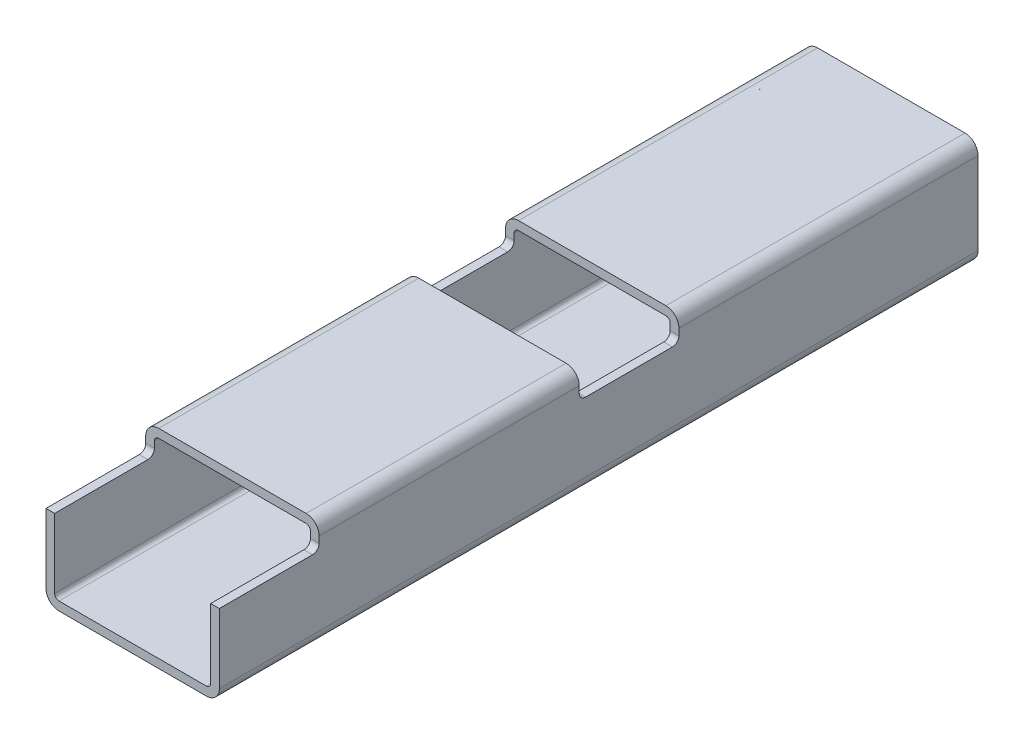
ISO-10303-21;
HEADER;
FILE_DESCRIPTION(('STEP AP214'),'2;1');
FILE_NAME('part.step','',(''),(''),'','','');
FILE_SCHEMA(('AUTOMOTIVE_DESIGN { 1 0 10303 214 1 1 1 1 }'));
ENDSEC;
DATA;
#1=APPLICATION_CONTEXT('core data for automotive mechanical design processes');
#2=APPLICATION_PROTOCOL_DEFINITION('international standard','automotive_design',2000,#1);
#3=PRODUCT_CONTEXT('',#1,'mechanical');
#4=PRODUCT('Part','Part','',(#3));
#5=PRODUCT_RELATED_PRODUCT_CATEGORY('part','',(#4));
#6=PRODUCT_DEFINITION_FORMATION('','',#4);
#7=PRODUCT_DEFINITION_CONTEXT('part definition',#1,'design');
#8=PRODUCT_DEFINITION('design','',#6,#7);
#9=PRODUCT_DEFINITION_SHAPE('','',#8);
#10=(LENGTH_UNIT() NAMED_UNIT(*) SI_UNIT(.MILLI.,.METRE.));
#11=(NAMED_UNIT(*) PLANE_ANGLE_UNIT() SI_UNIT($,.RADIAN.));
#12=(NAMED_UNIT(*) SI_UNIT($,.STERADIAN.) SOLID_ANGLE_UNIT());
#13=UNCERTAINTY_MEASURE_WITH_UNIT(LENGTH_MEASURE(1.E-05),#10,'distance_accuracy_value','');
#14=(GEOMETRIC_REPRESENTATION_CONTEXT(3) GLOBAL_UNCERTAINTY_ASSIGNED_CONTEXT((#13)) GLOBAL_UNIT_ASSIGNED_CONTEXT((#10,
#11,#12)) REPRESENTATION_CONTEXT('',''));
#15=CARTESIAN_POINT('',(0.,0.,0.));
#16=DIRECTION('',(0.,0.,1.));
#17=DIRECTION('',(1.,0.,0.));
#18=AXIS2_PLACEMENT_3D('',#15,#16,#17);
#19=CARTESIAN_POINT('',(34.,19.,350.));
#20=DIRECTION('',(0.,0.,-1.));
#21=DIRECTION('',(-1.,0.,0.));
#22=AXIS2_PLACEMENT_3D('',#19,#20,#21);
#23=CYLINDRICAL_SURFACE('',#22,6.);
#24=DIRECTION('',(0.,0.,-1.));
#25=VECTOR('',#24,1.);
#26=CARTESIAN_POINT('',(34.,25.,350.));
#27=LINE('',#26,#25);
#28=CARTESIAN_POINT('',(34.,25.,138.));
#29=VERTEX_POINT('',#28);
#30=CARTESIAN_POINT('',(34.,25.,0.));
#31=VERTEX_POINT('',#30);
#32=EDGE_CURVE('E343',#29,#31,#27,.T.);
#33=ORIENTED_EDGE('',*,*,#32,.F.);
#34=CARTESIAN_POINT('',(34.,19.,138.));
#35=DIRECTION('',(0.,0.,-1.));
#36=DIRECTION('',(-1.,0.,0.));
#37=AXIS2_PLACEMENT_3D('',#34,#35,#36);
#38=CIRCLE('',#37,6.);
#39=CARTESIAN_POINT('',(40.,19.,138.));
#40=VERTEX_POINT('',#39);
#41=EDGE_CURVE('E524',#29,#40,#38,.T.);
#42=ORIENTED_EDGE('',*,*,#41,.T.);
#43=DIRECTION('',(0.,0.,-1.));
#44=VECTOR('',#43,1.);
#45=CARTESIAN_POINT('',(40.,19.,350.));
#46=LINE('',#45,#44);
#47=CARTESIAN_POINT('',(40.,19.,0.));
#48=VERTEX_POINT('',#47);
#49=EDGE_CURVE('E346',#40,#48,#46,.T.);
#50=ORIENTED_EDGE('',*,*,#49,.T.);
#51=CARTESIAN_POINT('',(34.,19.,0.));
#52=DIRECTION('',(0.,0.,1.));
#53=DIRECTION('',(-1.,0.,0.));
#54=AXIS2_PLACEMENT_3D('',#51,#52,#53);
#55=CIRCLE('',#54,6.);
#56=EDGE_CURVE('E326',#48,#31,#55,.T.);
#57=ORIENTED_EDGE('',*,*,#56,.T.);
#58=EDGE_LOOP('',(#33,#42,#50,#57));
#59=FACE_BOUND('',#58,.T.);
#60=ADVANCED_FACE('F37',(#59),#23,.T.);
#61=CARTESIAN_POINT('',(-34.,25.,350.));
#62=DIRECTION('',(0.,-1.,0.));
#63=DIRECTION('',(0.,0.,-1.));
#64=AXIS2_PLACEMENT_3D('',#61,#62,#63);
#65=PLANE('',#64);
#66=DIRECTION('',(0.,0.,-1.));
#67=VECTOR('',#66,1.);
#68=CARTESIAN_POINT('',(-34.,25.,350.));
#69=LINE('',#68,#67);
#70=CARTESIAN_POINT('',(-34.,25.,138.));
#71=VERTEX_POINT('',#70);
#72=CARTESIAN_POINT('',(-34.,25.,0.));
#73=VERTEX_POINT('',#72);
#74=EDGE_CURVE('E340',#71,#73,#69,.T.);
#75=ORIENTED_EDGE('',*,*,#74,.F.);
#76=DIRECTION('',(1.,0.,0.));
#77=VECTOR('',#76,1.);
#78=CARTESIAN_POINT('',(-40.,25.,138.));
#79=LINE('',#78,#77);
#80=EDGE_CURVE('E465',#71,#29,#79,.T.);
#81=ORIENTED_EDGE('',*,*,#80,.T.);
#82=ORIENTED_EDGE('',*,*,#32,.T.);
#83=DIRECTION('',(-1.,0.,0.));
#84=VECTOR('',#83,1.);
#85=CARTESIAN_POINT('',(-34.,25.,0.));
#86=LINE('',#85,#84);
#87=EDGE_CURVE('E329',#31,#73,#86,.T.);
#88=ORIENTED_EDGE('',*,*,#87,.T.);
#89=EDGE_LOOP('',(#75,#81,#82,#88));
#90=FACE_BOUND('',#89,.T.);
#91=ADVANCED_FACE('F688',(#90),#65,.F.);
#92=CARTESIAN_POINT('',(-34.,19.,350.));
#93=DIRECTION('',(0.,0.,-1.));
#94=DIRECTION('',(-1.,0.,0.));
#95=AXIS2_PLACEMENT_3D('',#92,#93,#94);
#96=CYLINDRICAL_SURFACE('',#95,6.);
#97=DIRECTION('',(0.,0.,-1.));
#98=VECTOR('',#97,1.);
#99=CARTESIAN_POINT('',(-40.,19.,350.));
#100=LINE('',#99,#98);
#101=CARTESIAN_POINT('',(-40.,19.,138.));
#102=VERTEX_POINT('',#101);
#103=CARTESIAN_POINT('',(-40.,19.,0.));
#104=VERTEX_POINT('',#103);
#105=EDGE_CURVE('E309',#102,#104,#100,.T.);
#106=ORIENTED_EDGE('',*,*,#105,.F.);
#107=CARTESIAN_POINT('',(-34.,19.,138.));
#108=DIRECTION('',(0.,0.,-1.));
#109=DIRECTION('',(-1.,0.,0.));
#110=AXIS2_PLACEMENT_3D('',#107,#108,#109);
#111=CIRCLE('',#110,6.);
#112=EDGE_CURVE('E521',#102,#71,#111,.T.);
#113=ORIENTED_EDGE('',*,*,#112,.T.);
#114=ORIENTED_EDGE('',*,*,#74,.T.);
#115=CARTESIAN_POINT('',(-34.,19.,0.));
#116=DIRECTION('',(0.,0.,1.));
#117=DIRECTION('',(-1.,0.,0.));
#118=AXIS2_PLACEMENT_3D('',#115,#116,#117);
#119=CIRCLE('',#118,6.);
#120=EDGE_CURVE('E332',#73,#104,#119,.T.);
#121=ORIENTED_EDGE('',*,*,#120,.T.);
#122=EDGE_LOOP('',(#106,#113,#114,#121));
#123=FACE_BOUND('',#122,.T.);
#124=ADVANCED_FACE('F694',(#123),#96,.T.);
#125=CARTESIAN_POINT('',(34.,19.,350.));
#126=DIRECTION('',(0.,0.,-1.));
#127=DIRECTION('',(-1.,0.,0.));
#128=AXIS2_PLACEMENT_3D('',#125,#126,#127);
#129=CYLINDRICAL_SURFACE('',#128,1.99999999999999);
#130=CARTESIAN_POINT('',(34.,19.,138.));
#131=DIRECTION('',(0.,0.,-1.));
#132=DIRECTION('',(-1.,0.,0.));
#133=AXIS2_PLACEMENT_3D('',#130,#131,#132);
#134=CIRCLE('',#133,1.99999999999999);
#135=CARTESIAN_POINT('',(34.,21.,138.));
#136=VERTEX_POINT('',#135);
#137=CARTESIAN_POINT('',(36.,19.,138.));
#138=VERTEX_POINT('',#137);
#139=EDGE_CURVE('E517',#136,#138,#134,.T.);
#140=ORIENTED_EDGE('',*,*,#139,.F.);
#141=DIRECTION('',(0.,0.,-1.));
#142=VECTOR('',#141,1.);
#143=CARTESIAN_POINT('',(34.,21.,350.));
#144=LINE('',#143,#142);
#145=CARTESIAN_POINT('',(34.,21.,0.));
#146=VERTEX_POINT('',#145);
#147=EDGE_CURVE('E402',#136,#146,#144,.T.);
#148=ORIENTED_EDGE('',*,*,#147,.T.);
#149=CARTESIAN_POINT('',(34.,19.,0.));
#150=DIRECTION('',(0.,0.,1.));
#151=DIRECTION('',(-1.,0.,0.));
#152=AXIS2_PLACEMENT_3D('',#149,#150,#151);
#153=CIRCLE('',#152,1.99999999999999);
#154=CARTESIAN_POINT('',(36.,19.,0.));
#155=VERTEX_POINT('',#154);
#156=EDGE_CURVE('E568',#155,#146,#153,.T.);
#157=ORIENTED_EDGE('',*,*,#156,.F.);
#158=DIRECTION('',(0.,0.,-1.));
#159=VECTOR('',#158,1.);
#160=CARTESIAN_POINT('',(36.,19.,350.));
#161=LINE('',#160,#159);
#162=EDGE_CURVE('E405',#138,#155,#161,.T.);
#163=ORIENTED_EDGE('',*,*,#162,.F.);
#164=EDGE_LOOP('',(#140,#148,#157,#163));
#165=FACE_BOUND('',#164,.T.);
#166=ADVANCED_FACE('F608',(#165),#129,.F.);
#167=CARTESIAN_POINT('',(-34.,21.,350.));
#168=DIRECTION('',(0.,-1.,0.));
#169=DIRECTION('',(0.,0.,-1.));
#170=AXIS2_PLACEMENT_3D('',#167,#168,#169);
#171=PLANE('',#170);
#172=DIRECTION('',(1.,0.,0.));
#173=VECTOR('',#172,1.);
#174=CARTESIAN_POINT('',(-34.,21.,138.));
#175=LINE('',#174,#173);
#176=CARTESIAN_POINT('',(-34.,21.,138.));
#177=VERTEX_POINT('',#176);
#178=EDGE_CURVE('E515',#177,#136,#175,.T.);
#179=ORIENTED_EDGE('',*,*,#178,.F.);
#180=DIRECTION('',(0.,0.,-1.));
#181=VECTOR('',#180,1.);
#182=CARTESIAN_POINT('',(-34.,21.,350.));
#183=LINE('',#182,#181);
#184=CARTESIAN_POINT('',(-34.,21.,0.));
#185=VERTEX_POINT('',#184);
#186=EDGE_CURVE('E393',#177,#185,#183,.T.);
#187=ORIENTED_EDGE('',*,*,#186,.T.);
#188=DIRECTION('',(-1.,0.,0.));
#189=VECTOR('',#188,1.);
#190=CARTESIAN_POINT('',(-34.,21.,0.));
#191=LINE('',#190,#189);
#192=EDGE_CURVE('E571',#146,#185,#191,.T.);
#193=ORIENTED_EDGE('',*,*,#192,.F.);
#194=ORIENTED_EDGE('',*,*,#147,.F.);
#195=EDGE_LOOP('',(#179,#187,#193,#194));
#196=FACE_BOUND('',#195,.T.);
#197=ADVANCED_FACE('F613',(#196),#171,.T.);
#198=CARTESIAN_POINT('',(-34.,19.,350.));
#199=DIRECTION('',(0.,0.,-1.));
#200=DIRECTION('',(-1.,0.,0.));
#201=AXIS2_PLACEMENT_3D('',#198,#199,#200);
#202=CYLINDRICAL_SURFACE('',#201,2.);
#203=CARTESIAN_POINT('',(-34.,19.,138.));
#204=DIRECTION('',(0.,0.,-1.));
#205=DIRECTION('',(-1.,0.,0.));
#206=AXIS2_PLACEMENT_3D('',#203,#204,#205);
#207=CIRCLE('',#206,2.);
#208=CARTESIAN_POINT('',(-36.,19.,138.));
#209=VERTEX_POINT('',#208);
#210=EDGE_CURVE('E513',#209,#177,#207,.T.);
#211=ORIENTED_EDGE('',*,*,#210,.F.);
#212=DIRECTION('',(0.,0.,-1.));
#213=VECTOR('',#212,1.);
#214=CARTESIAN_POINT('',(-36.,19.,350.));
#215=LINE('',#214,#213);
#216=CARTESIAN_POINT('',(-36.,19.,0.));
#217=VERTEX_POINT('',#216);
#218=EDGE_CURVE('E394',#209,#217,#215,.T.);
#219=ORIENTED_EDGE('',*,*,#218,.T.);
#220=CARTESIAN_POINT('',(-34.,19.,0.));
#221=DIRECTION('',(0.,0.,1.));
#222=DIRECTION('',(-1.,0.,0.));
#223=AXIS2_PLACEMENT_3D('',#220,#221,#222);
#224=CIRCLE('',#223,2.);
#225=EDGE_CURVE('E574',#185,#217,#224,.T.);
#226=ORIENTED_EDGE('',*,*,#225,.F.);
#227=ORIENTED_EDGE('',*,*,#186,.F.);
#228=EDGE_LOOP('',(#211,#219,#226,#227));
#229=FACE_BOUND('',#228,.T.);
#230=ADVANCED_FACE('F617',(#229),#202,.F.);
#231=CARTESIAN_POINT('',(-34.,-19.,350.));
#232=DIRECTION('',(0.,0.,-1.));
#233=DIRECTION('',(-1.,0.,0.));
#234=AXIS2_PLACEMENT_3D('',#231,#232,#233);
#235=PLANE('',#234);
#236=DIRECTION('',(0.,1.,0.));
#237=VECTOR('',#236,1.);
#238=CARTESIAN_POINT('',(40.,-19.,350.));
#239=LINE('',#238,#237);
#240=CARTESIAN_POINT('',(40.,-19.,350.));
#241=VERTEX_POINT('',#240);
#242=CARTESIAN_POINT('',(40.,13.,350.));
#243=VERTEX_POINT('',#242);
#244=EDGE_CURVE('E307',#241,#243,#239,.T.);
#245=ORIENTED_EDGE('',*,*,#244,.T.);
#246=DIRECTION('',(1.,0.,0.));
#247=VECTOR('',#246,1.);
#248=CARTESIAN_POINT('',(-40.,13.,350.));
#249=LINE('',#248,#247);
#250=CARTESIAN_POINT('',(36.,13.,350.));
#251=VERTEX_POINT('',#250);
#252=EDGE_CURVE('E301',#251,#243,#249,.T.);
#253=ORIENTED_EDGE('',*,*,#252,.F.);
#254=DIRECTION('',(0.,1.,0.));
#255=VECTOR('',#254,1.);
#256=CARTESIAN_POINT('',(36.,-19.,350.));
#257=LINE('',#256,#255);
#258=CARTESIAN_POINT('',(36.,-19.,350.));
#259=VERTEX_POINT('',#258);
#260=EDGE_CURVE('E553',#259,#251,#257,.T.);
#261=ORIENTED_EDGE('',*,*,#260,.F.);
#262=CARTESIAN_POINT('',(34.,-19.,350.));
#263=DIRECTION('',(0.,0.,1.));
#264=DIRECTION('',(1.,0.,0.));
#265=AXIS2_PLACEMENT_3D('',#262,#263,#264);
#266=CIRCLE('',#265,2.);
#267=CARTESIAN_POINT('',(34.,-21.,350.));
#268=VERTEX_POINT('',#267);
#269=EDGE_CURVE('E551',#268,#259,#266,.T.);
#270=ORIENTED_EDGE('',*,*,#269,.F.);
#271=DIRECTION('',(1.,0.,0.));
#272=VECTOR('',#271,1.);
#273=CARTESIAN_POINT('',(-34.,-21.,350.));
#274=LINE('',#273,#272);
#275=CARTESIAN_POINT('',(-34.,-21.,350.));
#276=VERTEX_POINT('',#275);
#277=EDGE_CURVE('E548',#276,#268,#274,.T.);
#278=ORIENTED_EDGE('',*,*,#277,.F.);
#279=CARTESIAN_POINT('',(-34.,-19.,350.));
#280=DIRECTION('',(0.,0.,1.));
#281=DIRECTION('',(-1.,0.,0.));
#282=AXIS2_PLACEMENT_3D('',#279,#280,#281);
#283=CIRCLE('',#282,1.99999999999999);
#284=CARTESIAN_POINT('',(-36.,-19.,350.));
#285=VERTEX_POINT('',#284);
#286=EDGE_CURVE('E546',#285,#276,#283,.T.);
#287=ORIENTED_EDGE('',*,*,#286,.F.);
#288=DIRECTION('',(0.,-1.,0.));
#289=VECTOR('',#288,1.);
#290=CARTESIAN_POINT('',(-36.,-19.,350.));
#291=LINE('',#290,#289);
#292=CARTESIAN_POINT('',(-36.,13.,350.));
#293=VERTEX_POINT('',#292);
#294=EDGE_CURVE('E299',#293,#285,#291,.T.);
#295=ORIENTED_EDGE('',*,*,#294,.F.);
#296=CARTESIAN_POINT('',(-40.,13.,350.));
#297=VERTEX_POINT('',#296);
#298=EDGE_CURVE('E60',#297,#293,#249,.T.);
#299=ORIENTED_EDGE('',*,*,#298,.F.);
#300=DIRECTION('',(0.,-1.,0.));
#301=VECTOR('',#300,1.);
#302=CARTESIAN_POINT('',(-40.,-19.,350.));
#303=LINE('',#302,#301);
#304=CARTESIAN_POINT('',(-40.,-19.,350.));
#305=VERTEX_POINT('',#304);
#306=EDGE_CURVE('E296',#297,#305,#303,.T.);
#307=ORIENTED_EDGE('',*,*,#306,.T.);
#308=CARTESIAN_POINT('',(-34.,-19.,350.));
#309=DIRECTION('',(0.,0.,1.));
#310=DIRECTION('',(-1.,0.,0.));
#311=AXIS2_PLACEMENT_3D('',#308,#309,#310);
#312=CIRCLE('',#311,6.);
#313=CARTESIAN_POINT('',(-34.,-25.,350.));
#314=VERTEX_POINT('',#313);
#315=EDGE_CURVE('E336',#305,#314,#312,.T.);
#316=ORIENTED_EDGE('',*,*,#315,.T.);
#317=DIRECTION('',(1.,0.,0.));
#318=VECTOR('',#317,1.);
#319=CARTESIAN_POINT('',(-34.,-25.,350.));
#320=LINE('',#319,#318);
#321=CARTESIAN_POINT('',(34.,-25.,350.));
#322=VERTEX_POINT('',#321);
#323=EDGE_CURVE('E415',#314,#322,#320,.T.);
#324=ORIENTED_EDGE('',*,*,#323,.T.);
#325=CARTESIAN_POINT('',(34.,-19.,350.));
#326=DIRECTION('',(0.,0.,1.));
#327=DIRECTION('',(1.,0.,0.));
#328=AXIS2_PLACEMENT_3D('',#325,#326,#327);
#329=CIRCLE('',#328,6.);
#330=EDGE_CURVE('E311',#322,#241,#329,.T.);
#331=ORIENTED_EDGE('',*,*,#330,.T.);
#332=EDGE_LOOP('',(#245,#253,#261,#270,#278,#287,#295,#299,#307,#316,#324,#331));
#333=FACE_BOUND('',#332,.T.);
#334=ADVANCED_FACE('F294',(#333),#235,.F.);
#335=CARTESIAN_POINT('',(-34.,-19.,0.));
#336=DIRECTION('',(0.,0.,-1.));
#337=DIRECTION('',(-1.,0.,0.));
#338=AXIS2_PLACEMENT_3D('',#335,#336,#337);
#339=PLANE('',#338);
#340=CARTESIAN_POINT('',(-34.,-19.,0.));
#341=DIRECTION('',(0.,0.,1.));
#342=DIRECTION('',(-1.,0.,0.));
#343=AXIS2_PLACEMENT_3D('',#340,#341,#342);
#344=CIRCLE('',#343,6.);
#345=CARTESIAN_POINT('',(-40.,-19.,0.));
#346=VERTEX_POINT('',#345);
#347=CARTESIAN_POINT('',(-34.,-25.,0.));
#348=VERTEX_POINT('',#347);
#349=EDGE_CURVE('E315',#346,#348,#344,.T.);
#350=ORIENTED_EDGE('',*,*,#349,.F.);
#351=DIRECTION('',(0.,-1.,0.));
#352=VECTOR('',#351,1.);
#353=CARTESIAN_POINT('',(-40.,-19.,0.));
#354=LINE('',#353,#352);
#355=EDGE_CURVE('E335',#104,#346,#354,.T.);
#356=ORIENTED_EDGE('',*,*,#355,.F.);
#357=ORIENTED_EDGE('',*,*,#120,.F.);
#358=ORIENTED_EDGE('',*,*,#87,.F.);
#359=ORIENTED_EDGE('',*,*,#56,.F.);
#360=DIRECTION('',(0.,1.,0.));
#361=VECTOR('',#360,1.);
#362=CARTESIAN_POINT('',(40.,-19.,0.));
#363=LINE('',#362,#361);
#364=CARTESIAN_POINT('',(40.,-19.,0.));
#365=VERTEX_POINT('',#364);
#366=EDGE_CURVE('E323',#365,#48,#363,.T.);
#367=ORIENTED_EDGE('',*,*,#366,.F.);
#368=CARTESIAN_POINT('',(34.,-19.,0.));
#369=DIRECTION('',(0.,0.,1.));
#370=DIRECTION('',(1.,0.,0.));
#371=AXIS2_PLACEMENT_3D('',#368,#369,#370);
#372=CIRCLE('',#371,6.);
#373=CARTESIAN_POINT('',(34.,-25.,0.));
#374=VERTEX_POINT('',#373);
#375=EDGE_CURVE('E321',#374,#365,#372,.T.);
#376=ORIENTED_EDGE('',*,*,#375,.F.);
#377=DIRECTION('',(1.,0.,0.));
#378=VECTOR('',#377,1.);
#379=CARTESIAN_POINT('',(-34.,-25.,0.));
#380=LINE('',#379,#378);
#381=EDGE_CURVE('E318',#348,#374,#380,.T.);
#382=ORIENTED_EDGE('',*,*,#381,.F.);
#383=EDGE_LOOP('',(#350,#356,#357,#358,#359,#367,#376,#382));
#384=FACE_BOUND('',#383,.T.);
#385=DIRECTION('',(0.,-1.,0.));
#386=VECTOR('',#385,1.);
#387=CARTESIAN_POINT('',(-36.,-19.,0.));
#388=LINE('',#387,#386);
#389=CARTESIAN_POINT('',(-36.,-19.,0.));
#390=VERTEX_POINT('',#389);
#391=EDGE_CURVE('E549',#217,#390,#388,.T.);
#392=ORIENTED_EDGE('',*,*,#391,.T.);
#393=CARTESIAN_POINT('',(-34.,-19.,0.));
#394=DIRECTION('',(0.,0.,1.));
#395=DIRECTION('',(-1.,0.,0.));
#396=AXIS2_PLACEMENT_3D('',#393,#394,#395);
#397=CIRCLE('',#396,1.99999999999999);
#398=CARTESIAN_POINT('',(-34.,-21.,0.));
#399=VERTEX_POINT('',#398);
#400=EDGE_CURVE('E545',#390,#399,#397,.T.);
#401=ORIENTED_EDGE('',*,*,#400,.T.);
#402=DIRECTION('',(1.,0.,0.));
#403=VECTOR('',#402,1.);
#404=CARTESIAN_POINT('',(-34.,-21.,0.));
#405=LINE('',#404,#403);
#406=CARTESIAN_POINT('',(34.,-21.,0.));
#407=VERTEX_POINT('',#406);
#408=EDGE_CURVE('E559',#399,#407,#405,.T.);
#409=ORIENTED_EDGE('',*,*,#408,.T.);
#410=CARTESIAN_POINT('',(34.,-19.,0.));
#411=DIRECTION('',(0.,0.,1.));
#412=DIRECTION('',(1.,0.,0.));
#413=AXIS2_PLACEMENT_3D('',#410,#411,#412);
#414=CIRCLE('',#413,2.);
#415=CARTESIAN_POINT('',(36.,-19.,0.));
#416=VERTEX_POINT('',#415);
#417=EDGE_CURVE('E562',#407,#416,#414,.T.);
#418=ORIENTED_EDGE('',*,*,#417,.T.);
#419=DIRECTION('',(0.,1.,0.));
#420=VECTOR('',#419,1.);
#421=CARTESIAN_POINT('',(36.,-19.,0.));
#422=LINE('',#421,#420);
#423=EDGE_CURVE('E565',#416,#155,#422,.T.);
#424=ORIENTED_EDGE('',*,*,#423,.T.);
#425=ORIENTED_EDGE('',*,*,#156,.T.);
#426=ORIENTED_EDGE('',*,*,#192,.T.);
#427=ORIENTED_EDGE('',*,*,#225,.T.);
#428=EDGE_LOOP('',(#392,#401,#409,#418,#424,#425,#426,#427));
#429=FACE_BOUND('',#428,.T.);
#430=ADVANCED_FACE('F579',(#384,#429),#339,.T.);
#431=CARTESIAN_POINT('',(-34.,-19.,350.));
#432=DIRECTION('',(0.,0.,-1.));
#433=DIRECTION('',(-1.,0.,0.));
#434=AXIS2_PLACEMENT_3D('',#431,#432,#433);
#435=CYLINDRICAL_SURFACE('',#434,6.);
#436=ORIENTED_EDGE('',*,*,#349,.T.);
#437=DIRECTION('',(0.,0.,-1.));
#438=VECTOR('',#437,1.);
#439=CARTESIAN_POINT('',(-34.,-25.,350.));
#440=LINE('',#439,#438);
#441=EDGE_CURVE('E355',#314,#348,#440,.T.);
#442=ORIENTED_EDGE('',*,*,#441,.F.);
#443=ORIENTED_EDGE('',*,*,#315,.F.);
#444=DIRECTION('',(0.,0.,-1.));
#445=VECTOR('',#444,1.);
#446=CARTESIAN_POINT('',(-40.,-19.,350.));
#447=LINE('',#446,#445);
#448=EDGE_CURVE('E305',#305,#346,#447,.T.);
#449=ORIENTED_EDGE('',*,*,#448,.T.);
#450=EDGE_LOOP('',(#436,#442,#443,#449));
#451=FACE_BOUND('',#450,.T.);
#452=ADVANCED_FACE('F39',(#451),#435,.T.);
#453=CARTESIAN_POINT('',(-34.,-25.,350.));
#454=DIRECTION('',(0.,1.,0.));
#455=DIRECTION('',(0.,0.,1.));
#456=AXIS2_PLACEMENT_3D('',#453,#454,#455);
#457=PLANE('',#456);
#458=ORIENTED_EDGE('',*,*,#381,.T.);
#459=DIRECTION('',(0.,0.,-1.));
#460=VECTOR('',#459,1.);
#461=CARTESIAN_POINT('',(34.,-25.,350.));
#462=LINE('',#461,#460);
#463=EDGE_CURVE('E352',#322,#374,#462,.T.);
#464=ORIENTED_EDGE('',*,*,#463,.F.);
#465=ORIENTED_EDGE('',*,*,#323,.F.);
#466=ORIENTED_EDGE('',*,*,#441,.T.);
#467=EDGE_LOOP('',(#458,#464,#465,#466));
#468=FACE_BOUND('',#467,.T.);
#469=ADVANCED_FACE('F707',(#468),#457,.F.);
#470=CARTESIAN_POINT('',(34.,-19.,350.));
#471=DIRECTION('',(0.,0.,-1.));
#472=DIRECTION('',(-1.,0.,0.));
#473=AXIS2_PLACEMENT_3D('',#470,#471,#472);
#474=CYLINDRICAL_SURFACE('',#473,6.);
#475=ORIENTED_EDGE('',*,*,#375,.T.);
#476=DIRECTION('',(0.,0.,-1.));
#477=VECTOR('',#476,1.);
#478=CARTESIAN_POINT('',(40.,-19.,350.));
#479=LINE('',#478,#477);
#480=EDGE_CURVE('E349',#241,#365,#479,.T.);
#481=ORIENTED_EDGE('',*,*,#480,.F.);
#482=ORIENTED_EDGE('',*,*,#330,.F.);
#483=ORIENTED_EDGE('',*,*,#463,.T.);
#484=EDGE_LOOP('',(#475,#481,#482,#483));
#485=FACE_BOUND('',#484,.T.);
#486=ADVANCED_FACE('F422',(#485),#474,.T.);
#487=CARTESIAN_POINT('',(40.,-19.,350.));
#488=DIRECTION('',(-1.,0.,0.));
#489=DIRECTION('',(0.,0.,1.));
#490=AXIS2_PLACEMENT_3D('',#487,#488,#489);
#491=PLANE('',#490);
#492=CARTESIAN_POINT('',(40.,19.,304.));
#493=VERTEX_POINT('',#492);
#494=CARTESIAN_POINT('',(40.,19.,184.));
#495=VERTEX_POINT('',#494);
#496=EDGE_CURVE('E348',#493,#495,#46,.T.);
#497=ORIENTED_EDGE('',*,*,#496,.F.);
#498=DIRECTION('',(0.,1.,0.));
#499=VECTOR('',#498,1.);
#500=CARTESIAN_POINT('',(40.,16.,304.));
#501=LINE('',#500,#499);
#502=CARTESIAN_POINT('',(40.,16.,304.));
#503=VERTEX_POINT('',#502);
#504=EDGE_CURVE('E289',#503,#493,#501,.T.);
#505=ORIENTED_EDGE('',*,*,#504,.F.);
#506=CARTESIAN_POINT('',(40.,16.,307.));
#507=DIRECTION('',(1.,0.,0.));
#508=DIRECTION('',(0.,0.,-1.));
#509=AXIS2_PLACEMENT_3D('',#506,#507,#508);
#510=CIRCLE('',#509,2.99999999999997);
#511=CARTESIAN_POINT('',(40.,13.,307.));
#512=VERTEX_POINT('',#511);
#513=EDGE_CURVE('E434',#512,#503,#510,.T.);
#514=ORIENTED_EDGE('',*,*,#513,.F.);
#515=DIRECTION('',(0.,0.,-1.));
#516=VECTOR('',#515,1.);
#517=CARTESIAN_POINT('',(40.,13.,350.));
#518=LINE('',#517,#516);
#519=EDGE_CURVE('E431',#243,#512,#518,.T.);
#520=ORIENTED_EDGE('',*,*,#519,.F.);
#521=ORIENTED_EDGE('',*,*,#244,.F.);
#522=ORIENTED_EDGE('',*,*,#480,.T.);
#523=ORIENTED_EDGE('',*,*,#366,.T.);
#524=ORIENTED_EDGE('',*,*,#49,.F.);
#525=DIRECTION('',(0.,1.,0.));
#526=VECTOR('',#525,1.);
#527=CARTESIAN_POINT('',(40.,16.,138.));
#528=LINE('',#527,#526);
#529=CARTESIAN_POINT('',(40.,16.,138.));
#530=VERTEX_POINT('',#529);
#531=EDGE_CURVE('E466',#530,#40,#528,.T.);
#532=ORIENTED_EDGE('',*,*,#531,.F.);
#533=CARTESIAN_POINT('',(40.,16.,141.));
#534=DIRECTION('',(1.,0.,0.));
#535=DIRECTION('',(0.,0.,-1.));
#536=AXIS2_PLACEMENT_3D('',#533,#534,#535);
#537=CIRCLE('',#536,3.);
#538=CARTESIAN_POINT('',(40.,13.,141.));
#539=VERTEX_POINT('',#538);
#540=EDGE_CURVE('E455',#539,#530,#537,.T.);
#541=ORIENTED_EDGE('',*,*,#540,.F.);
#542=DIRECTION('',(0.,0.,-1.));
#543=VECTOR('',#542,1.);
#544=CARTESIAN_POINT('',(40.,13.,181.));
#545=LINE('',#544,#543);
#546=CARTESIAN_POINT('',(40.,13.,181.));
#547=VERTEX_POINT('',#546);
#548=EDGE_CURVE('E474',#547,#539,#545,.T.);
#549=ORIENTED_EDGE('',*,*,#548,.F.);
#550=CARTESIAN_POINT('',(40.,16.,181.));
#551=DIRECTION('',(1.,0.,0.));
#552=DIRECTION('',(0.,0.,1.));
#553=AXIS2_PLACEMENT_3D('',#550,#551,#552);
#554=CIRCLE('',#553,3.);
#555=CARTESIAN_POINT('',(40.,16.,184.));
#556=VERTEX_POINT('',#555);
#557=EDGE_CURVE('E471',#556,#547,#554,.T.);
#558=ORIENTED_EDGE('',*,*,#557,.F.);
#559=DIRECTION('',(0.,-1.,0.));
#560=VECTOR('',#559,1.);
#561=CARTESIAN_POINT('',(40.,16.,184.));
#562=LINE('',#561,#560);
#563=EDGE_CURVE('E468',#495,#556,#562,.T.);
#564=ORIENTED_EDGE('',*,*,#563,.F.);
#565=EDGE_LOOP('',(#497,#505,#514,#520,#521,#522,#523,#524,#532,#541,#549,#558,#564));
#566=FACE_BOUND('',#565,.T.);
#567=ADVANCED_FACE('F428',(#566),#491,.F.);
#568=CARTESIAN_POINT('',(34.,25.,304.));
#569=VERTEX_POINT('',#568);
#570=CARTESIAN_POINT('',(34.,25.,184.));
#571=VERTEX_POINT('',#570);
#572=EDGE_CURVE('E345',#569,#571,#27,.T.);
#573=ORIENTED_EDGE('',*,*,#572,.F.);
#574=CARTESIAN_POINT('',(34.,19.,304.));
#575=DIRECTION('',(0.,0.,-1.));
#576=DIRECTION('',(0.,1.,0.));
#577=AXIS2_PLACEMENT_3D('',#574,#575,#576);
#578=CIRCLE('',#577,6.);
#579=EDGE_CURVE('E542',#569,#493,#578,.T.);
#580=ORIENTED_EDGE('',*,*,#579,.T.);
#581=ORIENTED_EDGE('',*,*,#496,.T.);
#582=CARTESIAN_POINT('',(34.,19.,184.));
#583=DIRECTION('',(0.,0.,1.));
#584=DIRECTION('',(1.,0.,0.));
#585=AXIS2_PLACEMENT_3D('',#582,#583,#584);
#586=CIRCLE('',#585,6.);
#587=EDGE_CURVE('E504',#495,#571,#586,.T.);
#588=ORIENTED_EDGE('',*,*,#587,.T.);
#589=EDGE_LOOP('',(#573,#580,#581,#588));
#590=FACE_BOUND('',#589,.T.);
#591=ADVANCED_FACE('F644',(#590),#23,.T.);
#592=CARTESIAN_POINT('',(-34.,25.,304.));
#593=VERTEX_POINT('',#592);
#594=CARTESIAN_POINT('',(-34.,25.,184.));
#595=VERTEX_POINT('',#594);
#596=EDGE_CURVE('E342',#593,#595,#69,.T.);
#597=ORIENTED_EDGE('',*,*,#596,.F.);
#598=DIRECTION('',(1.,0.,0.));
#599=VECTOR('',#598,1.);
#600=CARTESIAN_POINT('',(-40.,25.,304.));
#601=LINE('',#600,#599);
#602=EDGE_CURVE('E382',#593,#569,#601,.T.);
#603=ORIENTED_EDGE('',*,*,#602,.T.);
#604=ORIENTED_EDGE('',*,*,#572,.T.);
#605=DIRECTION('',(1.,0.,0.));
#606=VECTOR('',#605,1.);
#607=CARTESIAN_POINT('',(-40.,25.,184.));
#608=LINE('',#607,#606);
#609=EDGE_CURVE('E490',#595,#571,#608,.T.);
#610=ORIENTED_EDGE('',*,*,#609,.F.);
#611=EDGE_LOOP('',(#597,#603,#604,#610));
#612=FACE_BOUND('',#611,.T.);
#613=ADVANCED_FACE('F641',(#612),#65,.F.);
#614=CARTESIAN_POINT('',(-40.,19.,304.));
#615=VERTEX_POINT('',#614);
#616=CARTESIAN_POINT('',(-40.,19.,184.));
#617=VERTEX_POINT('',#616);
#618=EDGE_CURVE('E339',#615,#617,#100,.T.);
#619=ORIENTED_EDGE('',*,*,#618,.F.);
#620=CARTESIAN_POINT('',(-34.,19.,304.));
#621=DIRECTION('',(0.,0.,-1.));
#622=DIRECTION('',(0.,1.,0.));
#623=AXIS2_PLACEMENT_3D('',#620,#621,#622);
#624=CIRCLE('',#623,6.);
#625=EDGE_CURVE('E539',#615,#593,#624,.T.);
#626=ORIENTED_EDGE('',*,*,#625,.T.);
#627=ORIENTED_EDGE('',*,*,#596,.T.);
#628=CARTESIAN_POINT('',(-34.,19.,184.));
#629=DIRECTION('',(0.,0.,1.));
#630=DIRECTION('',(1.,0.,0.));
#631=AXIS2_PLACEMENT_3D('',#628,#629,#630);
#632=CIRCLE('',#631,6.);
#633=EDGE_CURVE('E501',#595,#617,#632,.T.);
#634=ORIENTED_EDGE('',*,*,#633,.T.);
#635=EDGE_LOOP('',(#619,#626,#627,#634));
#636=FACE_BOUND('',#635,.T.);
#637=ADVANCED_FACE('F635',(#636),#96,.T.);
#638=CARTESIAN_POINT('',(-40.,-19.,350.));
#639=DIRECTION('',(1.,0.,0.));
#640=DIRECTION('',(0.,0.,-1.));
#641=AXIS2_PLACEMENT_3D('',#638,#639,#640);
#642=PLANE('',#641);
#643=CARTESIAN_POINT('',(-40.,16.,307.));
#644=DIRECTION('',(1.,0.,0.));
#645=DIRECTION('',(0.,0.,-1.));
#646=AXIS2_PLACEMENT_3D('',#643,#644,#645);
#647=CIRCLE('',#646,2.99999999999997);
#648=CARTESIAN_POINT('',(-40.,13.,307.));
#649=VERTEX_POINT('',#648);
#650=CARTESIAN_POINT('',(-40.,16.,304.));
#651=VERTEX_POINT('',#650);
#652=EDGE_CURVE('E288',#649,#651,#647,.T.);
#653=ORIENTED_EDGE('',*,*,#652,.T.);
#654=DIRECTION('',(0.,1.,0.));
#655=VECTOR('',#654,1.);
#656=CARTESIAN_POINT('',(-40.,16.,304.));
#657=LINE('',#656,#655);
#658=EDGE_CURVE('E381',#651,#615,#657,.T.);
#659=ORIENTED_EDGE('',*,*,#658,.T.);
#660=ORIENTED_EDGE('',*,*,#618,.T.);
#661=DIRECTION('',(0.,-1.,0.));
#662=VECTOR('',#661,1.);
#663=CARTESIAN_POINT('',(-40.,16.,184.));
#664=LINE('',#663,#662);
#665=CARTESIAN_POINT('',(-40.,16.,184.));
#666=VERTEX_POINT('',#665);
#667=EDGE_CURVE('E454',#617,#666,#664,.T.);
#668=ORIENTED_EDGE('',*,*,#667,.T.);
#669=CARTESIAN_POINT('',(-40.,16.,181.));
#670=DIRECTION('',(1.,0.,0.));
#671=DIRECTION('',(0.,0.,1.));
#672=AXIS2_PLACEMENT_3D('',#669,#670,#671);
#673=CIRCLE('',#672,3.);
#674=CARTESIAN_POINT('',(-40.,13.,181.));
#675=VERTEX_POINT('',#674);
#676=EDGE_CURVE('E52',#666,#675,#673,.T.);
#677=ORIENTED_EDGE('',*,*,#676,.T.);
#678=DIRECTION('',(0.,0.,-1.));
#679=VECTOR('',#678,1.);
#680=CARTESIAN_POINT('',(-40.,13.,181.));
#681=LINE('',#680,#679);
#682=CARTESIAN_POINT('',(-40.,13.,141.));
#683=VERTEX_POINT('',#682);
#684=EDGE_CURVE('E459',#675,#683,#681,.T.);
#685=ORIENTED_EDGE('',*,*,#684,.T.);
#686=CARTESIAN_POINT('',(-40.,16.,141.));
#687=DIRECTION('',(1.,0.,0.));
#688=DIRECTION('',(0.,0.,-1.));
#689=AXIS2_PLACEMENT_3D('',#686,#687,#688);
#690=CIRCLE('',#689,3.);
#691=CARTESIAN_POINT('',(-40.,16.,138.));
#692=VERTEX_POINT('',#691);
#693=EDGE_CURVE('E462',#683,#692,#690,.T.);
#694=ORIENTED_EDGE('',*,*,#693,.T.);
#695=DIRECTION('',(0.,1.,0.));
#696=VECTOR('',#695,1.);
#697=CARTESIAN_POINT('',(-40.,16.,138.));
#698=LINE('',#697,#696);
#699=EDGE_CURVE('E451',#692,#102,#698,.T.);
#700=ORIENTED_EDGE('',*,*,#699,.T.);
#701=ORIENTED_EDGE('',*,*,#105,.T.);
#702=ORIENTED_EDGE('',*,*,#355,.T.);
#703=ORIENTED_EDGE('',*,*,#448,.F.);
#704=ORIENTED_EDGE('',*,*,#306,.F.);
#705=DIRECTION('',(0.,0.,-1.));
#706=VECTOR('',#705,1.);
#707=CARTESIAN_POINT('',(-40.,13.,350.));
#708=LINE('',#707,#706);
#709=EDGE_CURVE('E280',#297,#649,#708,.T.);
#710=ORIENTED_EDGE('',*,*,#709,.T.);
#711=EDGE_LOOP('',(#653,#659,#660,#668,#677,#685,#694,#700,#701,#702,#703,#704,#710));
#712=FACE_BOUND('',#711,.T.);
#713=ADVANCED_FACE('F303',(#712),#642,.F.);
#714=CARTESIAN_POINT('',(-34.,-19.,350.));
#715=DIRECTION('',(0.,0.,-1.));
#716=DIRECTION('',(-1.,0.,0.));
#717=AXIS2_PLACEMENT_3D('',#714,#715,#716);
#718=CYLINDRICAL_SURFACE('',#717,1.99999999999999);
#719=ORIENTED_EDGE('',*,*,#400,.F.);
#720=DIRECTION('',(0.,0.,-1.));
#721=VECTOR('',#720,1.);
#722=CARTESIAN_POINT('',(-36.,-19.,350.));
#723=LINE('',#722,#721);
#724=EDGE_CURVE('E398',#285,#390,#723,.T.);
#725=ORIENTED_EDGE('',*,*,#724,.F.);
#726=ORIENTED_EDGE('',*,*,#286,.T.);
#727=DIRECTION('',(0.,0.,-1.));
#728=VECTOR('',#727,1.);
#729=CARTESIAN_POINT('',(-34.,-21.,350.));
#730=LINE('',#729,#728);
#731=EDGE_CURVE('E319',#276,#399,#730,.T.);
#732=ORIENTED_EDGE('',*,*,#731,.T.);
#733=EDGE_LOOP('',(#719,#725,#726,#732));
#734=FACE_BOUND('',#733,.T.);
#735=ADVANCED_FACE('F586',(#734),#718,.F.);
#736=CARTESIAN_POINT('',(-34.,-21.,350.));
#737=DIRECTION('',(0.,1.,0.));
#738=DIRECTION('',(0.,0.,1.));
#739=AXIS2_PLACEMENT_3D('',#736,#737,#738);
#740=PLANE('',#739);
#741=ORIENTED_EDGE('',*,*,#408,.F.);
#742=ORIENTED_EDGE('',*,*,#731,.F.);
#743=ORIENTED_EDGE('',*,*,#277,.T.);
#744=DIRECTION('',(0.,0.,-1.));
#745=VECTOR('',#744,1.);
#746=CARTESIAN_POINT('',(34.,-21.,350.));
#747=LINE('',#746,#745);
#748=EDGE_CURVE('E410',#268,#407,#747,.T.);
#749=ORIENTED_EDGE('',*,*,#748,.T.);
#750=EDGE_LOOP('',(#741,#742,#743,#749));
#751=FACE_BOUND('',#750,.T.);
#752=ADVANCED_FACE('F593',(#751),#740,.T.);
#753=CARTESIAN_POINT('',(34.,-19.,350.));
#754=DIRECTION('',(0.,0.,-1.));
#755=DIRECTION('',(-1.,0.,0.));
#756=AXIS2_PLACEMENT_3D('',#753,#754,#755);
#757=CYLINDRICAL_SURFACE('',#756,2.);
#758=ORIENTED_EDGE('',*,*,#417,.F.);
#759=ORIENTED_EDGE('',*,*,#748,.F.);
#760=ORIENTED_EDGE('',*,*,#269,.T.);
#761=DIRECTION('',(0.,0.,-1.));
#762=VECTOR('',#761,1.);
#763=CARTESIAN_POINT('',(36.,-19.,350.));
#764=LINE('',#763,#762);
#765=EDGE_CURVE('E408',#259,#416,#764,.T.);
#766=ORIENTED_EDGE('',*,*,#765,.T.);
#767=EDGE_LOOP('',(#758,#759,#760,#766));
#768=FACE_BOUND('',#767,.T.);
#769=ADVANCED_FACE('F596',(#768),#757,.F.);
#770=CARTESIAN_POINT('',(36.,-19.,350.));
#771=DIRECTION('',(-1.,0.,0.));
#772=DIRECTION('',(0.,-1.,0.));
#773=AXIS2_PLACEMENT_3D('',#770,#771,#772);
#774=PLANE('',#773);
#775=DIRECTION('',(0.,-1.,0.));
#776=VECTOR('',#775,1.);
#777=CARTESIAN_POINT('',(36.,-19.0000000000003,304.));
#778=LINE('',#777,#776);
#779=CARTESIAN_POINT('',(36.,19.,304.));
#780=VERTEX_POINT('',#779);
#781=CARTESIAN_POINT('',(36.,16.,304.));
#782=VERTEX_POINT('',#781);
#783=EDGE_CURVE('E537',#780,#782,#778,.T.);
#784=ORIENTED_EDGE('',*,*,#783,.F.);
#785=CARTESIAN_POINT('',(36.,19.,184.));
#786=VERTEX_POINT('',#785);
#787=EDGE_CURVE('E407',#780,#786,#161,.T.);
#788=ORIENTED_EDGE('',*,*,#787,.T.);
#789=DIRECTION('',(0.,1.,0.));
#790=VECTOR('',#789,1.);
#791=CARTESIAN_POINT('',(36.,-19.,184.));
#792=LINE('',#791,#790);
#793=CARTESIAN_POINT('',(36.,16.,184.));
#794=VERTEX_POINT('',#793);
#795=EDGE_CURVE('E499',#794,#786,#792,.T.);
#796=ORIENTED_EDGE('',*,*,#795,.F.);
#797=CARTESIAN_POINT('',(36.,16.,181.));
#798=DIRECTION('',(-1.,0.,0.));
#799=DIRECTION('',(0.,-1.,0.));
#800=AXIS2_PLACEMENT_3D('',#797,#798,#799);
#801=CIRCLE('',#800,3.);
#802=CARTESIAN_POINT('',(36.,13.,181.));
#803=VERTEX_POINT('',#802);
#804=EDGE_CURVE('E507',#803,#794,#801,.T.);
#805=ORIENTED_EDGE('',*,*,#804,.F.);
#806=DIRECTION('',(0.,0.,1.));
#807=VECTOR('',#806,1.);
#808=CARTESIAN_POINT('',(36.,13.,350.));
#809=LINE('',#808,#807);
#810=CARTESIAN_POINT('',(36.,13.,141.));
#811=VERTEX_POINT('',#810);
#812=EDGE_CURVE('E509',#811,#803,#809,.T.);
#813=ORIENTED_EDGE('',*,*,#812,.F.);
#814=CARTESIAN_POINT('',(36.,16.,141.));
#815=DIRECTION('',(-1.,0.,0.));
#816=DIRECTION('',(0.,-1.,0.));
#817=AXIS2_PLACEMENT_3D('',#814,#815,#816);
#818=CIRCLE('',#817,3.);
#819=CARTESIAN_POINT('',(36.,16.,138.));
#820=VERTEX_POINT('',#819);
#821=EDGE_CURVE('E511',#820,#811,#818,.T.);
#822=ORIENTED_EDGE('',*,*,#821,.F.);
#823=DIRECTION('',(0.,-1.,0.));
#824=VECTOR('',#823,1.);
#825=CARTESIAN_POINT('',(36.,-19.,138.));
#826=LINE('',#825,#824);
#827=EDGE_CURVE('E519',#138,#820,#826,.T.);
#828=ORIENTED_EDGE('',*,*,#827,.F.);
#829=ORIENTED_EDGE('',*,*,#162,.T.);
#830=ORIENTED_EDGE('',*,*,#423,.F.);
#831=ORIENTED_EDGE('',*,*,#765,.F.);
#832=ORIENTED_EDGE('',*,*,#260,.T.);
#833=DIRECTION('',(0.,0.,1.));
#834=VECTOR('',#833,1.);
#835=CARTESIAN_POINT('',(36.,13.,350.));
#836=LINE('',#835,#834);
#837=CARTESIAN_POINT('',(36.,13.,307.));
#838=VERTEX_POINT('',#837);
#839=EDGE_CURVE('E527',#838,#251,#836,.T.);
#840=ORIENTED_EDGE('',*,*,#839,.F.);
#841=CARTESIAN_POINT('',(36.,16.,307.));
#842=DIRECTION('',(-1.,0.,0.));
#843=DIRECTION('',(0.,-1.,0.));
#844=AXIS2_PLACEMENT_3D('',#841,#842,#843);
#845=CIRCLE('',#844,2.99999999999997);
#846=EDGE_CURVE('E529',#782,#838,#845,.T.);
#847=ORIENTED_EDGE('',*,*,#846,.F.);
#848=EDGE_LOOP('',(#784,#788,#796,#805,#813,#822,#828,#829,#830,#831,#832,#840,#847));
#849=FACE_BOUND('',#848,.T.);
#850=ADVANCED_FACE('F602',(#849),#774,.T.);
#851=CARTESIAN_POINT('',(34.,19.,304.));
#852=DIRECTION('',(0.,0.,-1.));
#853=DIRECTION('',(0.,1.,0.));
#854=AXIS2_PLACEMENT_3D('',#851,#852,#853);
#855=CIRCLE('',#854,1.99999999999999);
#856=CARTESIAN_POINT('',(34.,21.,304.));
#857=VERTEX_POINT('',#856);
#858=EDGE_CURVE('E535',#857,#780,#855,.T.);
#859=ORIENTED_EDGE('',*,*,#858,.F.);
#860=CARTESIAN_POINT('',(34.,21.,184.));
#861=VERTEX_POINT('',#860);
#862=EDGE_CURVE('E404',#857,#861,#144,.T.);
#863=ORIENTED_EDGE('',*,*,#862,.T.);
#864=CARTESIAN_POINT('',(34.,19.,184.));
#865=DIRECTION('',(0.,0.,1.));
#866=DIRECTION('',(1.,0.,0.));
#867=AXIS2_PLACEMENT_3D('',#864,#865,#866);
#868=CIRCLE('',#867,1.99999999999999);
#869=EDGE_CURVE('E497',#786,#861,#868,.T.);
#870=ORIENTED_EDGE('',*,*,#869,.F.);
#871=ORIENTED_EDGE('',*,*,#787,.F.);
#872=EDGE_LOOP('',(#859,#863,#870,#871));
#873=FACE_BOUND('',#872,.T.);
#874=ADVANCED_FACE('F663',(#873),#129,.F.);
#875=DIRECTION('',(1.,0.,0.));
#876=VECTOR('',#875,1.);
#877=CARTESIAN_POINT('',(-34.,21.,304.));
#878=LINE('',#877,#876);
#879=CARTESIAN_POINT('',(-34.,21.,304.));
#880=VERTEX_POINT('',#879);
#881=EDGE_CURVE('E533',#880,#857,#878,.T.);
#882=ORIENTED_EDGE('',*,*,#881,.F.);
#883=CARTESIAN_POINT('',(-34.,21.,184.));
#884=VERTEX_POINT('',#883);
#885=EDGE_CURVE('E396',#880,#884,#183,.T.);
#886=ORIENTED_EDGE('',*,*,#885,.T.);
#887=DIRECTION('',(-1.,0.,0.));
#888=VECTOR('',#887,1.);
#889=CARTESIAN_POINT('',(-34.,21.,184.));
#890=LINE('',#889,#888);
#891=EDGE_CURVE('E495',#861,#884,#890,.T.);
#892=ORIENTED_EDGE('',*,*,#891,.F.);
#893=ORIENTED_EDGE('',*,*,#862,.F.);
#894=EDGE_LOOP('',(#882,#886,#892,#893));
#895=FACE_BOUND('',#894,.T.);
#896=ADVANCED_FACE('F670',(#895),#171,.T.);
#897=CARTESIAN_POINT('',(-34.,19.,304.));
#898=DIRECTION('',(0.,0.,-1.));
#899=DIRECTION('',(0.,1.,0.));
#900=AXIS2_PLACEMENT_3D('',#897,#898,#899);
#901=CIRCLE('',#900,2.);
#902=CARTESIAN_POINT('',(-36.,19.,304.));
#903=VERTEX_POINT('',#902);
#904=EDGE_CURVE('E531',#903,#880,#901,.T.);
#905=ORIENTED_EDGE('',*,*,#904,.F.);
#906=CARTESIAN_POINT('',(-36.,19.,184.));
#907=VERTEX_POINT('',#906);
#908=EDGE_CURVE('E389',#903,#907,#215,.T.);
#909=ORIENTED_EDGE('',*,*,#908,.T.);
#910=CARTESIAN_POINT('',(-34.,19.,184.));
#911=DIRECTION('',(0.,0.,1.));
#912=DIRECTION('',(1.,0.,0.));
#913=AXIS2_PLACEMENT_3D('',#910,#911,#912);
#914=CIRCLE('',#913,2.);
#915=EDGE_CURVE('E448',#884,#907,#914,.T.);
#916=ORIENTED_EDGE('',*,*,#915,.F.);
#917=ORIENTED_EDGE('',*,*,#885,.F.);
#918=EDGE_LOOP('',(#905,#909,#916,#917));
#919=FACE_BOUND('',#918,.T.);
#920=ADVANCED_FACE('F672',(#919),#202,.F.);
#921=CARTESIAN_POINT('',(-36.,-19.,350.));
#922=DIRECTION('',(1.,0.,0.));
#923=DIRECTION('',(0.,1.,0.));
#924=AXIS2_PLACEMENT_3D('',#921,#922,#923);
#925=PLANE('',#924);
#926=DIRECTION('',(0.,1.,0.));
#927=VECTOR('',#926,1.);
#928=CARTESIAN_POINT('',(-36.,-19.0000000000003,304.));
#929=LINE('',#928,#927);
#930=CARTESIAN_POINT('',(-36.,16.,304.));
#931=VERTEX_POINT('',#930);
#932=EDGE_CURVE('E11',#931,#903,#929,.T.);
#933=ORIENTED_EDGE('',*,*,#932,.F.);
#934=CARTESIAN_POINT('',(-36.,16.,307.));
#935=DIRECTION('',(1.,0.,0.));
#936=DIRECTION('',(0.,1.,0.));
#937=AXIS2_PLACEMENT_3D('',#934,#935,#936);
#938=CIRCLE('',#937,2.99999999999997);
#939=CARTESIAN_POINT('',(-36.,13.,307.));
#940=VERTEX_POINT('',#939);
#941=EDGE_CURVE('E45',#940,#931,#938,.T.);
#942=ORIENTED_EDGE('',*,*,#941,.F.);
#943=DIRECTION('',(0.,0.,-1.));
#944=VECTOR('',#943,1.);
#945=CARTESIAN_POINT('',(-36.,13.,350.));
#946=LINE('',#945,#944);
#947=EDGE_CURVE('E368',#293,#940,#946,.T.);
#948=ORIENTED_EDGE('',*,*,#947,.F.);
#949=ORIENTED_EDGE('',*,*,#294,.T.);
#950=ORIENTED_EDGE('',*,*,#724,.T.);
#951=ORIENTED_EDGE('',*,*,#391,.F.);
#952=ORIENTED_EDGE('',*,*,#218,.F.);
#953=DIRECTION('',(0.,1.,0.));
#954=VECTOR('',#953,1.);
#955=CARTESIAN_POINT('',(-36.,-19.,138.));
#956=LINE('',#955,#954);
#957=CARTESIAN_POINT('',(-36.,16.,138.));
#958=VERTEX_POINT('',#957);
#959=EDGE_CURVE('E366',#958,#209,#956,.T.);
#960=ORIENTED_EDGE('',*,*,#959,.F.);
#961=CARTESIAN_POINT('',(-36.,16.,141.));
#962=DIRECTION('',(1.,0.,0.));
#963=DIRECTION('',(0.,1.,0.));
#964=AXIS2_PLACEMENT_3D('',#961,#962,#963);
#965=CIRCLE('',#964,3.);
#966=CARTESIAN_POINT('',(-36.,13.,141.));
#967=VERTEX_POINT('',#966);
#968=EDGE_CURVE('E364',#967,#958,#965,.T.);
#969=ORIENTED_EDGE('',*,*,#968,.F.);
#970=DIRECTION('',(0.,0.,-1.));
#971=VECTOR('',#970,1.);
#972=CARTESIAN_POINT('',(-36.,13.,350.));
#973=LINE('',#972,#971);
#974=CARTESIAN_POINT('',(-36.,13.,181.));
#975=VERTEX_POINT('',#974);
#976=EDGE_CURVE('E362',#975,#967,#973,.T.);
#977=ORIENTED_EDGE('',*,*,#976,.F.);
#978=CARTESIAN_POINT('',(-36.,16.,181.));
#979=DIRECTION('',(1.,0.,0.));
#980=DIRECTION('',(0.,1.,0.));
#981=AXIS2_PLACEMENT_3D('',#978,#979,#980);
#982=CIRCLE('',#981,3.);
#983=CARTESIAN_POINT('',(-36.,16.,184.));
#984=VERTEX_POINT('',#983);
#985=EDGE_CURVE('E360',#984,#975,#982,.T.);
#986=ORIENTED_EDGE('',*,*,#985,.F.);
#987=DIRECTION('',(0.,-1.,0.));
#988=VECTOR('',#987,1.);
#989=CARTESIAN_POINT('',(-36.,-19.,184.));
#990=LINE('',#989,#988);
#991=EDGE_CURVE('E358',#907,#984,#990,.T.);
#992=ORIENTED_EDGE('',*,*,#991,.F.);
#993=ORIENTED_EDGE('',*,*,#908,.F.);
#994=EDGE_LOOP('',(#933,#942,#948,#949,#950,#951,#952,#960,#969,#977,#986,#992,#993));
#995=FACE_BOUND('',#994,.T.);
#996=ADVANCED_FACE('F386',(#995),#925,.T.);
#997=CARTESIAN_POINT('',(-40.,16.,138.));
#998=DIRECTION('',(0.,0.,-1.));
#999=DIRECTION('',(-1.,0.,0.));
#1000=AXIS2_PLACEMENT_3D('',#997,#998,#999);
#1001=PLANE('',#1000);
#1002=ORIENTED_EDGE('',*,*,#80,.F.);
#1003=ORIENTED_EDGE('',*,*,#112,.F.);
#1004=ORIENTED_EDGE('',*,*,#699,.F.);
#1005=DIRECTION('',(1.,0.,0.));
#1006=VECTOR('',#1005,1.);
#1007=CARTESIAN_POINT('',(-40.,16.,138.));
#1008=LINE('',#1007,#1006);
#1009=EDGE_CURVE('E437',#692,#958,#1008,.T.);
#1010=ORIENTED_EDGE('',*,*,#1009,.T.);
#1011=ORIENTED_EDGE('',*,*,#959,.T.);
#1012=ORIENTED_EDGE('',*,*,#210,.T.);
#1013=ORIENTED_EDGE('',*,*,#178,.T.);
#1014=ORIENTED_EDGE('',*,*,#139,.T.);
#1015=ORIENTED_EDGE('',*,*,#827,.T.);
#1016=EDGE_CURVE('E441',#820,#530,#1008,.T.);
#1017=ORIENTED_EDGE('',*,*,#1016,.T.);
#1018=ORIENTED_EDGE('',*,*,#531,.T.);
#1019=ORIENTED_EDGE('',*,*,#41,.F.);
#1020=EDGE_LOOP('',(#1002,#1003,#1004,#1010,#1011,#1012,#1013,#1014,#1015,#1017,#1018,#1019));
#1021=FACE_BOUND('',#1020,.T.);
#1022=ADVANCED_FACE('F619',(#1021),#1001,.F.);
#1023=CARTESIAN_POINT('',(-40.,16.,141.));
#1024=DIRECTION('',(1.,0.,0.));
#1025=DIRECTION('',(0.,0.,-1.));
#1026=AXIS2_PLACEMENT_3D('',#1023,#1024,#1025);
#1027=CYLINDRICAL_SURFACE('',#1026,3.);
#1028=ORIENTED_EDGE('',*,*,#821,.T.);
#1029=DIRECTION('',(1.,0.,0.));
#1030=VECTOR('',#1029,1.);
#1031=CARTESIAN_POINT('',(-40.,13.,141.));
#1032=LINE('',#1031,#1030);
#1033=EDGE_CURVE('E482',#811,#539,#1032,.T.);
#1034=ORIENTED_EDGE('',*,*,#1033,.T.);
#1035=ORIENTED_EDGE('',*,*,#540,.T.);
#1036=ORIENTED_EDGE('',*,*,#1016,.F.);
#1037=EDGE_LOOP('',(#1028,#1034,#1035,#1036));
#1038=FACE_BOUND('',#1037,.T.);
#1039=ADVANCED_FACE('F762',(#1038),#1027,.F.);
#1040=CARTESIAN_POINT('',(-40.,13.,181.));
#1041=DIRECTION('',(0.,-1.,0.));
#1042=DIRECTION('',(0.,0.,-1.));
#1043=AXIS2_PLACEMENT_3D('',#1040,#1041,#1042);
#1044=PLANE('',#1043);
#1045=ORIENTED_EDGE('',*,*,#812,.T.);
#1046=DIRECTION('',(1.,0.,0.));
#1047=VECTOR('',#1046,1.);
#1048=CARTESIAN_POINT('',(-40.,13.,181.));
#1049=LINE('',#1048,#1047);
#1050=EDGE_CURVE('E486',#803,#547,#1049,.T.);
#1051=ORIENTED_EDGE('',*,*,#1050,.T.);
#1052=ORIENTED_EDGE('',*,*,#548,.T.);
#1053=ORIENTED_EDGE('',*,*,#1033,.F.);
#1054=EDGE_LOOP('',(#1045,#1051,#1052,#1053));
#1055=FACE_BOUND('',#1054,.T.);
#1056=ADVANCED_FACE('F768',(#1055),#1044,.F.);
#1057=CARTESIAN_POINT('',(-40.,16.,181.));
#1058=DIRECTION('',(1.,0.,0.));
#1059=DIRECTION('',(0.,0.,-1.));
#1060=AXIS2_PLACEMENT_3D('',#1057,#1058,#1059);
#1061=CYLINDRICAL_SURFACE('',#1060,3.);
#1062=ORIENTED_EDGE('',*,*,#804,.T.);
#1063=DIRECTION('',(1.,0.,0.));
#1064=VECTOR('',#1063,1.);
#1065=CARTESIAN_POINT('',(-40.,16.,184.));
#1066=LINE('',#1065,#1064);
#1067=EDGE_CURVE('E489',#794,#556,#1066,.T.);
#1068=ORIENTED_EDGE('',*,*,#1067,.T.);
#1069=ORIENTED_EDGE('',*,*,#557,.T.);
#1070=ORIENTED_EDGE('',*,*,#1050,.F.);
#1071=EDGE_LOOP('',(#1062,#1068,#1069,#1070));
#1072=FACE_BOUND('',#1071,.T.);
#1073=ADVANCED_FACE('F653',(#1072),#1061,.F.);
#1074=CARTESIAN_POINT('',(-40.,16.,184.));
#1075=DIRECTION('',(0.,0.,1.));
#1076=DIRECTION('',(1.,0.,0.));
#1077=AXIS2_PLACEMENT_3D('',#1074,#1075,#1076);
#1078=PLANE('',#1077);
#1079=ORIENTED_EDGE('',*,*,#563,.T.);
#1080=ORIENTED_EDGE('',*,*,#1067,.F.);
#1081=ORIENTED_EDGE('',*,*,#795,.T.);
#1082=ORIENTED_EDGE('',*,*,#869,.T.);
#1083=ORIENTED_EDGE('',*,*,#891,.T.);
#1084=ORIENTED_EDGE('',*,*,#915,.T.);
#1085=ORIENTED_EDGE('',*,*,#991,.T.);
#1086=EDGE_CURVE('E487',#666,#984,#1066,.T.);
#1087=ORIENTED_EDGE('',*,*,#1086,.F.);
#1088=ORIENTED_EDGE('',*,*,#667,.F.);
#1089=ORIENTED_EDGE('',*,*,#633,.F.);
#1090=ORIENTED_EDGE('',*,*,#609,.T.);
#1091=ORIENTED_EDGE('',*,*,#587,.F.);
#1092=EDGE_LOOP('',(#1079,#1080,#1081,#1082,#1083,#1084,#1085,#1087,#1088,#1089,#1090,#1091));
#1093=FACE_BOUND('',#1092,.T.);
#1094=ADVANCED_FACE('F631',(#1093),#1078,.F.);
#1095=ORIENTED_EDGE('',*,*,#968,.T.);
#1096=ORIENTED_EDGE('',*,*,#1009,.F.);
#1097=ORIENTED_EDGE('',*,*,#693,.F.);
#1098=EDGE_CURVE('E479',#683,#967,#1032,.T.);
#1099=ORIENTED_EDGE('',*,*,#1098,.T.);
#1100=EDGE_LOOP('',(#1095,#1096,#1097,#1099));
#1101=FACE_BOUND('',#1100,.T.);
#1102=ADVANCED_FACE('F624',(#1101),#1027,.F.);
#1103=ORIENTED_EDGE('',*,*,#976,.T.);
#1104=ORIENTED_EDGE('',*,*,#1098,.F.);
#1105=ORIENTED_EDGE('',*,*,#684,.F.);
#1106=EDGE_CURVE('E483',#675,#975,#1049,.T.);
#1107=ORIENTED_EDGE('',*,*,#1106,.T.);
#1108=EDGE_LOOP('',(#1103,#1104,#1105,#1107));
#1109=FACE_BOUND('',#1108,.T.);
#1110=ADVANCED_FACE('F628',(#1109),#1044,.F.);
#1111=ORIENTED_EDGE('',*,*,#985,.T.);
#1112=ORIENTED_EDGE('',*,*,#1106,.F.);
#1113=ORIENTED_EDGE('',*,*,#676,.F.);
#1114=ORIENTED_EDGE('',*,*,#1086,.T.);
#1115=EDGE_LOOP('',(#1111,#1112,#1113,#1114));
#1116=FACE_BOUND('',#1115,.T.);
#1117=ADVANCED_FACE('F629',(#1116),#1061,.F.);
#1118=CARTESIAN_POINT('',(-40.,16.,304.));
#1119=DIRECTION('',(0.,0.,-1.));
#1120=DIRECTION('',(0.,1.,0.));
#1121=AXIS2_PLACEMENT_3D('',#1118,#1119,#1120);
#1122=PLANE('',#1121);
#1123=ORIENTED_EDGE('',*,*,#602,.F.);
#1124=ORIENTED_EDGE('',*,*,#625,.F.);
#1125=ORIENTED_EDGE('',*,*,#658,.F.);
#1126=DIRECTION('',(1.,0.,0.));
#1127=VECTOR('',#1126,1.);
#1128=CARTESIAN_POINT('',(-40.,16.,304.));
#1129=LINE('',#1128,#1127);
#1130=EDGE_CURVE('E373',#651,#931,#1129,.T.);
#1131=ORIENTED_EDGE('',*,*,#1130,.T.);
#1132=ORIENTED_EDGE('',*,*,#932,.T.);
#1133=ORIENTED_EDGE('',*,*,#904,.T.);
#1134=ORIENTED_EDGE('',*,*,#881,.T.);
#1135=ORIENTED_EDGE('',*,*,#858,.T.);
#1136=ORIENTED_EDGE('',*,*,#783,.T.);
#1137=EDGE_CURVE('E383',#782,#503,#1129,.T.);
#1138=ORIENTED_EDGE('',*,*,#1137,.T.);
#1139=ORIENTED_EDGE('',*,*,#504,.T.);
#1140=ORIENTED_EDGE('',*,*,#579,.F.);
#1141=EDGE_LOOP('',(#1123,#1124,#1125,#1131,#1132,#1133,#1134,#1135,#1136,#1138,#1139,#1140));
#1142=FACE_BOUND('',#1141,.T.);
#1143=ADVANCED_FACE('F378',(#1142),#1122,.F.);
#1144=CARTESIAN_POINT('',(-40.,16.,307.));
#1145=DIRECTION('',(1.,0.,0.));
#1146=DIRECTION('',(0.,0.,-1.));
#1147=AXIS2_PLACEMENT_3D('',#1144,#1145,#1146);
#1148=CYLINDRICAL_SURFACE('',#1147,2.99999999999997);
#1149=ORIENTED_EDGE('',*,*,#846,.T.);
#1150=DIRECTION('',(1.,0.,0.));
#1151=VECTOR('',#1150,1.);
#1152=CARTESIAN_POINT('',(-40.,13.,307.));
#1153=LINE('',#1152,#1151);
#1154=EDGE_CURVE('E300',#838,#512,#1153,.T.);
#1155=ORIENTED_EDGE('',*,*,#1154,.T.);
#1156=ORIENTED_EDGE('',*,*,#513,.T.);
#1157=ORIENTED_EDGE('',*,*,#1137,.F.);
#1158=EDGE_LOOP('',(#1149,#1155,#1156,#1157));
#1159=FACE_BOUND('',#1158,.T.);
#1160=ADVANCED_FACE('F675',(#1159),#1148,.F.);
#1161=CARTESIAN_POINT('',(-40.,13.,350.));
#1162=DIRECTION('',(0.,-1.,0.));
#1163=DIRECTION('',(0.,0.,-1.));
#1164=AXIS2_PLACEMENT_3D('',#1161,#1162,#1163);
#1165=PLANE('',#1164);
#1166=ORIENTED_EDGE('',*,*,#839,.T.);
#1167=ORIENTED_EDGE('',*,*,#252,.T.);
#1168=ORIENTED_EDGE('',*,*,#519,.T.);
#1169=ORIENTED_EDGE('',*,*,#1154,.F.);
#1170=EDGE_LOOP('',(#1166,#1167,#1168,#1169));
#1171=FACE_BOUND('',#1170,.T.);
#1172=ADVANCED_FACE('F677',(#1171),#1165,.F.);
#1173=ORIENTED_EDGE('',*,*,#941,.T.);
#1174=ORIENTED_EDGE('',*,*,#1130,.F.);
#1175=ORIENTED_EDGE('',*,*,#652,.F.);
#1176=EDGE_CURVE('E283',#649,#940,#1153,.T.);
#1177=ORIENTED_EDGE('',*,*,#1176,.T.);
#1178=EDGE_LOOP('',(#1173,#1174,#1175,#1177));
#1179=FACE_BOUND('',#1178,.T.);
#1180=ADVANCED_FACE('F372',(#1179),#1148,.F.);
#1181=ORIENTED_EDGE('',*,*,#947,.T.);
#1182=ORIENTED_EDGE('',*,*,#1176,.F.);
#1183=ORIENTED_EDGE('',*,*,#709,.F.);
#1184=ORIENTED_EDGE('',*,*,#298,.T.);
#1185=EDGE_LOOP('',(#1181,#1182,#1183,#1184));
#1186=FACE_BOUND('',#1185,.T.);
#1187=ADVANCED_FACE('F281',(#1186),#1165,.F.);
#1188=CLOSED_SHELL('',(#60,#91,#124,#166,#197,#230,#334,#430,#452,#469,#486,#567,#591,#613,#637,
#713,#735,#752,#769,#850,#874,#896,#920,#996,#1022,#1039,#1056,#1073,#1094,#1102,#1110,#1117,
#1143,#1160,#1172,#1180,#1187));
#1189=MANIFOLD_SOLID_BREP('B2',#1188);
#1190=ADVANCED_BREP_SHAPE_REPRESENTATION('',(#18,#1189),#14);
#1191=SHAPE_DEFINITION_REPRESENTATION(#9,#1190);
ENDSEC;
END-ISO-10303-21;
